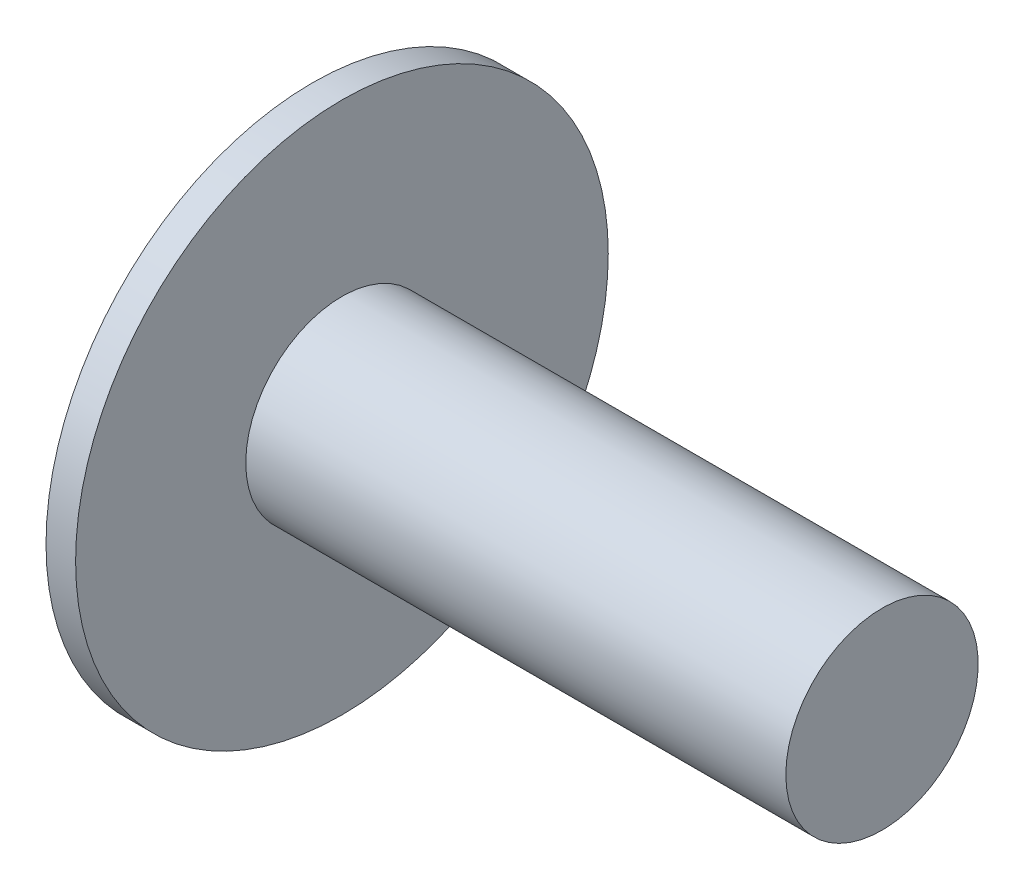
ISO-10303-21;
HEADER;
FILE_DESCRIPTION(('STEP AP214'),'2;1');
FILE_NAME('part.step','',(''),(''),'','','');
FILE_SCHEMA(('AUTOMOTIVE_DESIGN { 1 0 10303 214 1 1 1 1 }'));
ENDSEC;
DATA;
#1=APPLICATION_CONTEXT('core data for automotive mechanical design processes');
#2=APPLICATION_PROTOCOL_DEFINITION('international standard','automotive_design',2000,#1);
#3=PRODUCT_CONTEXT('',#1,'mechanical');
#4=PRODUCT('Part','Part','',(#3));
#5=PRODUCT_RELATED_PRODUCT_CATEGORY('part','',(#4));
#6=PRODUCT_DEFINITION_FORMATION('','',#4);
#7=PRODUCT_DEFINITION_CONTEXT('part definition',#1,'design');
#8=PRODUCT_DEFINITION('design','',#6,#7);
#9=PRODUCT_DEFINITION_SHAPE('','',#8);
#10=(LENGTH_UNIT() NAMED_UNIT(*) SI_UNIT(.MILLI.,.METRE.));
#11=(NAMED_UNIT(*) PLANE_ANGLE_UNIT() SI_UNIT($,.RADIAN.));
#12=(NAMED_UNIT(*) SI_UNIT($,.STERADIAN.) SOLID_ANGLE_UNIT());
#13=UNCERTAINTY_MEASURE_WITH_UNIT(LENGTH_MEASURE(1.E-05),#10,'distance_accuracy_value','');
#14=(GEOMETRIC_REPRESENTATION_CONTEXT(3) GLOBAL_UNCERTAINTY_ASSIGNED_CONTEXT((#13)) GLOBAL_UNIT_ASSIGNED_CONTEXT((#10,
#11,#12)) REPRESENTATION_CONTEXT('',''));
#15=CARTESIAN_POINT('',(0.,0.,0.));
#16=DIRECTION('',(0.,0.,1.));
#17=DIRECTION('',(1.,0.,0.));
#18=AXIS2_PLACEMENT_3D('',#15,#16,#17);
#19=CARTESIAN_POINT('',(0.,6.5,0.));
#20=DIRECTION('',(-1.,0.,0.));
#21=DIRECTION('',(0.,0.,1.));
#22=AXIS2_PLACEMENT_3D('',#19,#20,#21);
#23=PLANE('',#22);
#24=CARTESIAN_POINT('',(0.,0.,0.));
#25=DIRECTION('',(-1.,0.,0.));
#26=DIRECTION('',(0.,0.,1.));
#27=AXIS2_PLACEMENT_3D('',#24,#25,#26);
#28=CIRCLE('',#27,18.);
#29=CARTESIAN_POINT('',(0.,0.,18.));
#30=VERTEX_POINT('',#29);
#31=EDGE_CURVE('E10',#30,#30,#28,.T.);
#32=ORIENTED_EDGE('',*,*,#31,.F.);
#33=EDGE_LOOP('',(#32));
#34=FACE_BOUND('',#33,.T.);
#35=CARTESIAN_POINT('',(0.,0.,0.));
#36=DIRECTION('',(-1.,0.,0.));
#37=DIRECTION('',(0.,0.,1.));
#38=AXIS2_PLACEMENT_3D('',#35,#36,#37);
#39=CIRCLE('',#38,6.5);
#40=CARTESIAN_POINT('',(0.,0.,6.5));
#41=VERTEX_POINT('',#40);
#42=EDGE_CURVE('E44',#41,#41,#39,.T.);
#43=ORIENTED_EDGE('',*,*,#42,.T.);
#44=EDGE_LOOP('',(#43));
#45=FACE_BOUND('',#44,.T.);
#46=ADVANCED_FACE('F30',(#34,#45),#23,.F.);
#47=CARTESIAN_POINT('',(-29.6613199166142,0.,0.));
#48=DIRECTION('',(-1.,0.,0.));
#49=DIRECTION('',(0.,0.,1.));
#50=AXIS2_PLACEMENT_3D('',#47,#48,#49);
#51=CYLINDRICAL_SURFACE('',#50,18.);
#52=CARTESIAN_POINT('',(-2.,0.,0.));
#53=DIRECTION('',(-1.,0.,0.));
#54=DIRECTION('',(0.,0.,1.));
#55=AXIS2_PLACEMENT_3D('',#52,#53,#54);
#56=CIRCLE('',#55,18.);
#57=CARTESIAN_POINT('',(-2.,0.,18.));
#58=VERTEX_POINT('',#57);
#59=EDGE_CURVE('E36',#58,#58,#56,.T.);
#60=ORIENTED_EDGE('',*,*,#59,.F.);
#61=EDGE_LOOP('',(#60));
#62=FACE_BOUND('',#61,.T.);
#63=ORIENTED_EDGE('',*,*,#31,.T.);
#64=EDGE_LOOP('',(#63));
#65=FACE_BOUND('',#64,.T.);
#66=ADVANCED_FACE('F64',(#62,#65),#51,.T.);
#67=CARTESIAN_POINT('',(-2.,18.,0.));
#68=DIRECTION('',(1.,0.,0.));
#69=DIRECTION('',(0.,0.,-1.));
#70=AXIS2_PLACEMENT_3D('',#67,#68,#69);
#71=PLANE('',#70);
#72=ORIENTED_EDGE('',*,*,#59,.T.);
#73=EDGE_LOOP('',(#72));
#74=FACE_BOUND('',#73,.T.);
#75=ADVANCED_FACE('F59',(#74),#71,.F.);
#76=CARTESIAN_POINT('',(36.5,0.,0.));
#77=DIRECTION('',(-1.,0.,0.));
#78=DIRECTION('',(0.,0.,1.));
#79=AXIS2_PLACEMENT_3D('',#76,#77,#78);
#80=PLANE('',#79);
#81=CARTESIAN_POINT('',(36.5,0.,0.));
#82=DIRECTION('',(-1.,0.,0.));
#83=DIRECTION('',(0.,0.,1.));
#84=AXIS2_PLACEMENT_3D('',#81,#82,#83);
#85=CIRCLE('',#84,6.5);
#86=CARTESIAN_POINT('',(36.5,0.,6.5));
#87=VERTEX_POINT('',#86);
#88=EDGE_CURVE('E40',#87,#87,#85,.T.);
#89=ORIENTED_EDGE('',*,*,#88,.F.);
#90=EDGE_LOOP('',(#89));
#91=FACE_BOUND('',#90,.T.);
#92=ADVANCED_FACE('F54',(#91),#80,.F.);
#93=CARTESIAN_POINT('',(-29.6613199166142,0.,0.));
#94=DIRECTION('',(-1.,0.,0.));
#95=DIRECTION('',(0.,0.,1.));
#96=AXIS2_PLACEMENT_3D('',#93,#94,#95);
#97=CYLINDRICAL_SURFACE('',#96,6.5);
#98=ORIENTED_EDGE('',*,*,#42,.F.);
#99=EDGE_LOOP('',(#98));
#100=FACE_BOUND('',#99,.T.);
#101=ORIENTED_EDGE('',*,*,#88,.T.);
#102=EDGE_LOOP('',(#101));
#103=FACE_BOUND('',#102,.T.);
#104=ADVANCED_FACE('F51',(#100,#103),#97,.T.);
#105=CLOSED_SHELL('',(#46,#66,#75,#92,#104));
#106=MANIFOLD_SOLID_BREP('B2',#105);
#107=ADVANCED_BREP_SHAPE_REPRESENTATION('',(#18,#106),#14);
#108=SHAPE_DEFINITION_REPRESENTATION(#9,#107);
ENDSEC;
END-ISO-10303-21;
